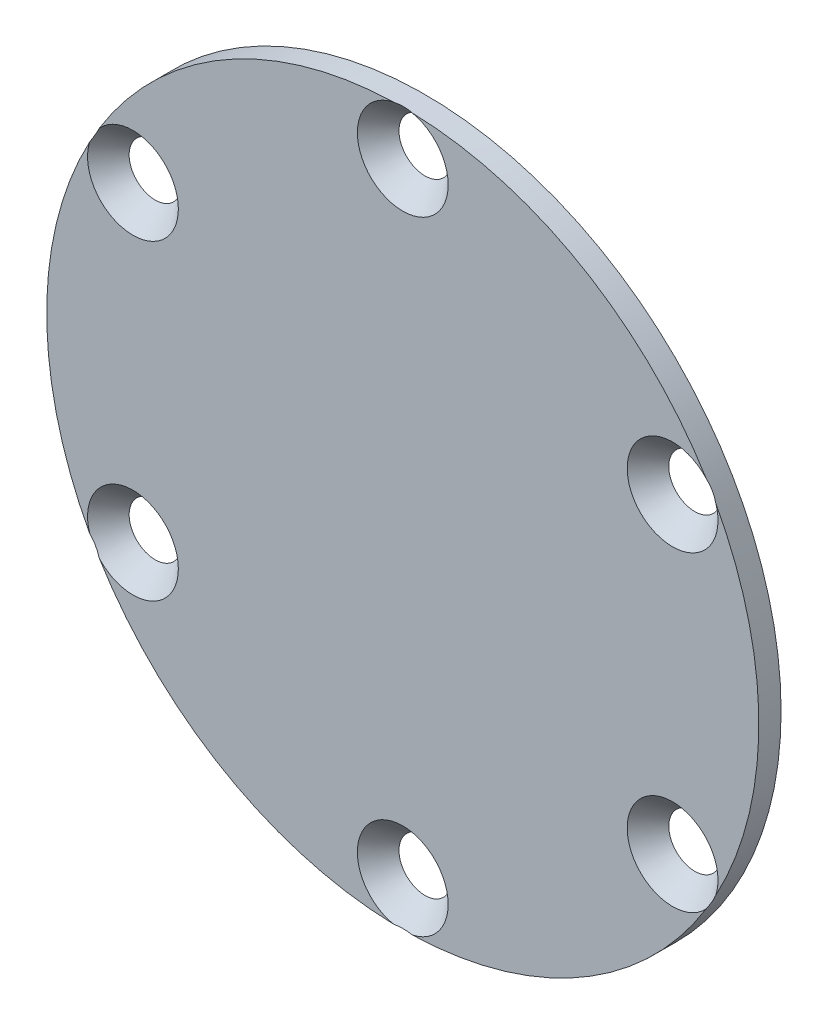
ISO-10303-21;
HEADER;
FILE_DESCRIPTION(('STEP AP214'),'2;1');
FILE_NAME('part.step','',(''),(''),'','','');
FILE_SCHEMA(('AUTOMOTIVE_DESIGN { 1 0 10303 214 1 1 1 1 }'));
ENDSEC;
DATA;
#1=APPLICATION_CONTEXT('core data for automotive mechanical design processes');
#2=APPLICATION_PROTOCOL_DEFINITION('international standard','automotive_design',2000,#1);
#3=PRODUCT_CONTEXT('',#1,'mechanical');
#4=PRODUCT('Part','Part','',(#3));
#5=PRODUCT_RELATED_PRODUCT_CATEGORY('part','',(#4));
#6=PRODUCT_DEFINITION_FORMATION('','',#4);
#7=PRODUCT_DEFINITION_CONTEXT('part definition',#1,'design');
#8=PRODUCT_DEFINITION('design','',#6,#7);
#9=PRODUCT_DEFINITION_SHAPE('','',#8);
#10=(LENGTH_UNIT() NAMED_UNIT(*) SI_UNIT(.MILLI.,.METRE.));
#11=(NAMED_UNIT(*) PLANE_ANGLE_UNIT() SI_UNIT($,.RADIAN.));
#12=(NAMED_UNIT(*) SI_UNIT($,.STERADIAN.) SOLID_ANGLE_UNIT());
#13=UNCERTAINTY_MEASURE_WITH_UNIT(LENGTH_MEASURE(1.E-05),#10,'distance_accuracy_value','');
#14=(GEOMETRIC_REPRESENTATION_CONTEXT(3) GLOBAL_UNCERTAINTY_ASSIGNED_CONTEXT((#13)) GLOBAL_UNIT_ASSIGNED_CONTEXT((#10,
#11,#12)) REPRESENTATION_CONTEXT('',''));
#15=CARTESIAN_POINT('',(0.,0.,0.));
#16=DIRECTION('',(0.,0.,1.));
#17=DIRECTION('',(1.,0.,0.));
#18=AXIS2_PLACEMENT_3D('',#15,#16,#17);
#19=CARTESIAN_POINT('',(0.,0.,1.5875));
#20=DIRECTION('',(0.,0.,-1.));
#21=DIRECTION('',(-1.,0.,0.));
#22=AXIS2_PLACEMENT_3D('',#19,#20,#21);
#23=CYLINDRICAL_SURFACE('',#22,25.4);
#24=CARTESIAN_POINT('',(0.,0.,1.5875));
#25=DIRECTION('',(0.,0.,1.));
#26=DIRECTION('',(1.,0.,0.));
#27=AXIS2_PLACEMENT_3D('',#24,#25,#26);
#28=CIRCLE('',#27,25.4);
#29=CARTESIAN_POINT('',(-0.682167803609317,25.3908378571428,1.5875));
#30=VERTEX_POINT('',#29);
#31=CARTESIAN_POINT('',(-21.6480267058526,13.2861935761411,1.5875));
#32=VERTEX_POINT('',#31);
#33=EDGE_CURVE('E94',#30,#32,#28,.T.);
#34=ORIENTED_EDGE('',*,*,#33,.F.);
#35=CARTESIAN_POINT('',(-1.10813327144891,25.3758160588523,1.70426259723294));
#36=CARTESIAN_POINT('',(-1.03858546910732,25.3788538370796,1.68100724010702));
#37=CARTESIAN_POINT('',(-0.968407543113004,25.3816312618641,1.65953701311462));
#38=CARTESIAN_POINT('',(-0.826688796066698,25.3866425824605,1.62052580747523));
#39=CARTESIAN_POINT('',(-0.75514407573568,25.3888745491067,1.6029987919676));
#40=CARTESIAN_POINT('',(-0.602140773588031,25.3929908906209,1.57050348648753));
#41=CARTESIAN_POINT('',(-0.520553288266637,25.3947978058421,1.55612227692921));
#42=CARTESIAN_POINT('',(-0.356490417125455,25.3976307080457,1.53349858253767));
#43=CARTESIAN_POINT('',(-0.274014817999217,25.398656502976,1.52525760739814));
#44=CARTESIAN_POINT('',(-0.108784871770269,25.3999011973798,1.51525061839919));
#45=CARTESIAN_POINT('',(-0.026031123351573,25.4001212972263,1.513474972125));
#46=CARTESIAN_POINT('',(0.139330093782125,25.3997523575857,1.51644557388797));
#47=CARTESIAN_POINT('',(0.22193760376031,25.3991636031298,1.52118952449341));
#48=CARTESIAN_POINT('',(0.367899173950457,25.3974153879827,1.53521019689812));
#49=CARTESIAN_POINT('',(0.43138094193177,25.3964151774016,1.5432186203364));
#50=CARTESIAN_POINT('',(0.557730565008054,25.3939545635952,1.5628256963906));
#51=CARTESIAN_POINT('',(0.620598795374312,25.3924944625676,1.57442199130001));
#52=CARTESIAN_POINT('',(0.802397667513501,25.3876029526052,1.61303783201307));
#53=CARTESIAN_POINT('',(0.920385540794634,25.3835855706627,1.64449952175929));
#54=CARTESIAN_POINT('',(1.15311526480074,25.374079805848,1.71770283464408));
#55=CARTESIAN_POINT('',(1.2678536227911,25.3685899019818,1.7594550834468));
#56=CARTESIAN_POINT('',(1.49441861886097,25.3562546261583,1.85145781773012));
#57=CARTESIAN_POINT('',(1.60622805418499,25.349402686106,1.9017493032261));
#58=CARTESIAN_POINT('',(1.82647288878544,25.3344859200496,2.00892993635709));
#59=CARTESIAN_POINT('',(1.93490942121521,25.3264215068151,2.06581683717262));
#60=CARTESIAN_POINT('',(2.13747427703046,25.3100852627391,2.17851558005401));
#61=CARTESIAN_POINT('',(2.23190439137552,25.3019252512772,2.23380665698919));
#62=CARTESIAN_POINT('',(2.41788342749443,25.2848267124478,2.34736556954315));
#63=CARTESIAN_POINT('',(2.50944898579432,25.2758946952924,2.4056070711099));
#64=CARTESIAN_POINT('',(2.6000760301225,25.2665708919431,2.4651659220088));
#65=B_SPLINE_CURVE_WITH_KNOTS('',3,(#35,#36,#37,#38,#39,#40,#41,#42,#43,#44,#45,#46,#47,#48,#49,
#50,#51,#52,#53,#54,#55,#56,#57,#58,#59,#60,#61,#62,#63,#64),.UNSPECIFIED.,.F.,.F.,(4,2,2,2,2,2,
2,2,2,2,2,2,2,2,4),(0.,0.220192199221614,0.441152251301994,0.68952104599925,0.937950886767347,
1.18601045082805,1.43398262393278,1.62585404453421,1.81759964704789,2.18349923150444,
2.54977822539337,2.91786834223411,3.28583343050666,3.6149439274665,3.9415086906618),.UNSPECIFIED.);
#66=CARTESIAN_POINT('',(0.682167803609285,25.3908378571429,1.5875));
#67=VERTEX_POINT('',#66);
#68=EDGE_CURVE('E11',#30,#67,#65,.T.);
#69=ORIENTED_EDGE('',*,*,#68,.T.);
#70=CARTESIAN_POINT('',(21.6480267058527,13.2861935761409,1.5875));
#71=VERTEX_POINT('',#70);
#72=EDGE_CURVE('E96',#71,#67,#28,.T.);
#73=ORIENTED_EDGE('',*,*,#72,.F.);
#74=CARTESIAN_POINT('',(21.3810091530071,13.7117631105204,1.7304857640241));
#75=CARTESIAN_POINT('',(21.4251537785731,13.6429301950826,1.70148609943137));
#76=CARTESIAN_POINT('',(21.4694464799764,13.573129703822,1.67486845359258));
#77=CARTESIAN_POINT('',(21.5583420855567,13.4314886256569,1.62701288608322));
#78=CARTESIAN_POINT('',(21.6029455222661,13.3596410088896,1.6057968574607));
#79=CARTESIAN_POINT('',(21.6899144454002,13.2179490514082,1.5704989962979));
#80=CARTESIAN_POINT('',(21.7322814136551,13.1481816099002,1.55611598912737));
#81=CARTESIAN_POINT('',(21.8167820941267,13.0074882839178,1.53349096011117));
#82=CARTESIAN_POINT('',(21.8589157549769,12.9365621569347,1.52525024109716));
#83=CARTESIAN_POINT('',(21.9426075139185,12.7940919228617,1.51524821748298));
#84=CARTESIAN_POINT('',(21.9841665386342,12.7225492144744,1.51347486129034));
#85=CARTESIAN_POINT('',(22.0665113380646,12.5791854810932,1.51644739067956));
#86=CARTESIAN_POINT('',(22.1072973742836,12.5073645604929,1.52119103013882));
#87=CARTESIAN_POINT('',(22.1787531323253,12.3801036678383,1.53520953289352));
#88=CARTESIAN_POINT('',(22.2096244990284,12.3246327385235,1.54321688713062));
#89=CARTESIAN_POINT('',(22.2706685039146,12.2139803920665,1.5628231854216));
#90=CARTESIAN_POINT('',(22.3008414432226,12.1587988583996,1.57442054944183));
#91=CARTESIAN_POINT('',(22.3875377105626,11.9988497716892,1.61305111060762));
#92=CARTESIAN_POINT('',(22.4430808427565,11.8946064231529,1.64453252650078));
#93=CARTESIAN_POINT('',(22.551267665268,11.6881966842813,1.7177852553753));
#94=CARTESIAN_POINT('',(22.6039082607159,11.5860325814749,1.7595673014942));
#95=CARTESIAN_POINT('',(22.7065031015382,11.3836566281053,1.85158894410794));
#96=CARTESIAN_POINT('',(22.7564460637336,11.2834539503464,1.90186090464235));
#97=CARTESIAN_POINT('',(22.8535969103649,11.0853631820879,2.00899190469568));
#98=CARTESIAN_POINT('',(22.9008058304346,10.9874742235962,2.06584842522786));
#99=CARTESIAN_POINT('',(22.9731820475459,10.8349756884023,2.15946328139934));
#100=CARTESIAN_POINT('',(22.9991800108234,10.7796754480238,2.19447816971296));
#101=CARTESIAN_POINT('',(23.0502776971159,10.669973615359,2.26584271803109));
#102=CARTESIAN_POINT('',(23.0753812536929,10.6155689165087,2.30218484909052));
#103=CARTESIAN_POINT('',(23.1001269296781,10.5614457264505,2.33917547271507));
#104=B_SPLINE_CURVE_WITH_KNOTS('',3,(#74,#75,#76,#77,#78,#79,#80,#81,#82,#83,#84,#85,#86,#87,
#88,#89,#90,#91,#92,#93,#94,#95,#96,#97,#98,#99,#100,#101,#102,#103),.UNSPECIFIED.,.F.,.F.,(4,2,
2,2,2,2,2,2,2,2,2,2,2,2,4),(0.,0.260320342657759,0.521679558673097,0.770100636879063,
1.01857439232923,1.26658489265943,1.51450993608704,1.7063606066707,1.89812695977924,
2.26421816266294,2.63069245268699,2.99859667288012,3.36636060983308,3.57762360089746,
3.78783282114336),.UNSPECIFIED.);
#105=CARTESIAN_POINT('',(22.330194509462,12.1046442810019,1.5875));
#106=VERTEX_POINT('',#105);
#107=EDGE_CURVE('E44',#71,#106,#104,.T.);
#108=ORIENTED_EDGE('',*,*,#107,.T.);
#109=CARTESIAN_POINT('',(22.3301945094629,-12.1046442810002,1.5875));
#110=VERTEX_POINT('',#109);
#111=EDGE_CURVE('E106',#110,#106,#28,.T.);
#112=ORIENTED_EDGE('',*,*,#111,.F.);
#113=CARTESIAN_POINT('',(23.1814585491073,-10.3817137090184,2.46505114810237));
#114=CARTESIAN_POINT('',(23.1515876396771,-10.4484106155031,2.41726611692696));
#115=CARTESIAN_POINT('',(23.1211954979839,-10.5155040932901,2.37034258851684));
#116=CARTESIAN_POINT('',(23.0592697251213,-10.6506158108581,2.27855099910734));
#117=CARTESIAN_POINT('',(23.0277355571746,-10.7186344758673,2.2336839277356));
#118=CARTESIAN_POINT('',(22.9631663808992,-10.856280108849,2.14599193214943));
#119=CARTESIAN_POINT('',(22.9301204379703,-10.9259160343221,2.10318896445831));
#120=CARTESIAN_POINT('',(22.8627118706754,-11.0662759699742,2.02053766943613));
#121=CARTESIAN_POINT('',(22.8283494120389,-11.1369998425306,1.98068897204874));
#122=CARTESIAN_POINT('',(22.7221289660061,-11.3530120241208,1.86523926683746));
#123=CARTESIAN_POINT('',(22.6480557623411,-11.5001774795046,1.79501931620064));
#124=CARTESIAN_POINT('',(22.4938126864946,-11.7990009273611,1.67479100435845));
#125=CARTESIAN_POINT('',(22.4136685630177,-11.9506384450719,1.62470240098767));
#126=CARTESIAN_POINT('',(22.2919512937197,-12.1752013489967,1.57045560918109));
#127=CARTESIAN_POINT('',(22.252633207184,-12.2469215265158,1.55605338499192));
#128=CARTESIAN_POINT('',(22.1728646199339,-12.3907557748581,1.53340909977394));
#129=CARTESIAN_POINT('',(22.1324137597674,-12.4628699647305,1.52516901763232));
#130=CARTESIAN_POINT('',(22.0508658350057,-12.6065896322718,1.51522142629661));
#131=CARTESIAN_POINT('',(22.009774360909,-12.6781954820758,1.51347356902007));
#132=CARTESIAN_POINT('',(21.9269676342852,-12.8208771059618,1.51646817992184));
#133=CARTESIAN_POINT('',(21.8852526148994,-12.8919530639727,1.52120827948725));
#134=CARTESIAN_POINT('',(21.8108695899338,-13.017297069676,1.53520786734876));
#135=CARTESIAN_POINT('',(21.7782748498308,-13.0717533256563,1.54321256591905));
#136=CARTESIAN_POINT('',(21.7129691722526,-13.179945541526,1.56281694614074));
#137=CARTESIAN_POINT('',(21.6802582236153,-13.2336814297189,1.57441698289634));
#138=CARTESIAN_POINT('',(21.5851768217254,-13.3885898057994,1.61301080663122));
#139=CARTESIAN_POINT('',(21.5227704223982,-13.488656388605,1.64443240598781));
#140=CARTESIAN_POINT('',(21.3983067748759,-13.685248967243,1.71753496760279));
#141=CARTESIAN_POINT('',(21.3362499463545,-13.781771258481,1.75922633200466));
#142=CARTESIAN_POINT('',(21.212284734069,-13.9718266560027,1.85119165027065));
#143=CARTESIAN_POINT('',(21.1503805156757,-14.0653337448685,1.90152430778462));
#144=CARTESIAN_POINT('',(21.027207053808,-14.2488165482237,2.00880395470955));
#145=CARTESIAN_POINT('',(20.965937638598,-14.3387932371894,2.06574910148253));
#146=CARTESIAN_POINT('',(20.8416864359646,-14.5188328783428,2.18706315512061));
#147=CARTESIAN_POINT('',(20.7787249052945,-14.6087764579337,2.25162848256032));
#148=CARTESIAN_POINT('',(20.6532404945114,-14.7856489169382,2.38518726422885));
#149=CARTESIAN_POINT('',(20.5907177132492,-14.8725771333466,2.45418168291934));
#150=CARTESIAN_POINT('',(20.4670907471154,-15.0422413960153,2.59440896752139));
#151=CARTESIAN_POINT('',(20.405981056701,-15.125024432115,2.66558050441011));
#152=CARTESIAN_POINT('',(20.283989382095,-15.2882342855845,2.81061068938628));
#153=CARTESIAN_POINT('',(20.223107261695,-15.3686628203186,2.88446728615431));
#154=CARTESIAN_POINT('',(20.1622559386768,-15.4480884080617,2.95937929734814));
#155=B_SPLINE_CURVE_WITH_KNOTS('',3,(#113,#114,#115,#116,#117,#118,#119,#120,#121,#122,#123,
#124,#125,#126,#127,#128,#129,#130,#131,#132,#133,#134,#135,#136,#137,#138,#139,#140,#141,#142,
#143,#144,#145,#146,#147,#148,#149,#150,#151,#152,#153,#154),.UNSPECIFIED.,.F.,.F.,(4,2,2,2,2,2,
2,2,2,2,2,2,2,2,2,2,2,2,2,2,4),(0.,0.26195643045652,0.524037626190311,0.788472305841067,
1.05287380584499,1.58921149474204,2.12338965663384,2.37233504246596,2.62136033939602,
2.86883537158573,3.11622008008078,3.3080191178143,3.49983710518664,3.86534653341997,
4.23122771594704,4.59970065363787,4.96807115785892,5.35003692501063,5.73208615154805,
6.10736549833682,6.48236392936831),.UNSPECIFIED.);
#156=CARTESIAN_POINT('',(21.6480267058522,-13.2861935761417,1.5875));
#157=VERTEX_POINT('',#156);
#158=EDGE_CURVE('E127',#110,#157,#155,.T.);
#159=ORIENTED_EDGE('',*,*,#158,.T.);
#160=CARTESIAN_POINT('',(0.682167803610037,-25.3908378571428,1.5875));
#161=VERTEX_POINT('',#160);
#162=EDGE_CURVE('E117',#161,#157,#28,.T.);
#163=ORIENTED_EDGE('',*,*,#162,.F.);
#164=CARTESIAN_POINT('',(1.10813327144959,-25.3758160588523,1.70426259723293));
#165=CARTESIAN_POINT('',(1.03858546910801,-25.3788538370796,1.68100724010701));
#166=CARTESIAN_POINT('',(0.968407543113698,-25.3816312618641,1.65953701311462));
#167=CARTESIAN_POINT('',(0.826688796067403,-25.3866425824605,1.62052580747523));
#168=CARTESIAN_POINT('',(0.755144075736392,-25.3888745491067,1.6029987919676));
#169=CARTESIAN_POINT('',(0.602140773588749,-25.3929908906209,1.57050348648753));
#170=CARTESIAN_POINT('',(0.520553288267355,-25.3947978058421,1.55612227692921));
#171=CARTESIAN_POINT('',(0.356490417126174,-25.3976307080457,1.53349858253767));
#172=CARTESIAN_POINT('',(0.274014817999936,-25.398656502976,1.52525760739814));
#173=CARTESIAN_POINT('',(0.108784871770987,-25.3999011973798,1.51525061839919));
#174=CARTESIAN_POINT('',(0.0260311233522914,-25.4001212972263,1.513474972125));
#175=CARTESIAN_POINT('',(-0.139330093781407,-25.3997523575857,1.51644557388797));
#176=CARTESIAN_POINT('',(-0.221937603759592,-25.3991636031298,1.52118952449341));
#177=CARTESIAN_POINT('',(-0.367899173949739,-25.3974153879827,1.53521019689813));
#178=CARTESIAN_POINT('',(-0.431380941931052,-25.3964151774016,1.54321862033641));
#179=CARTESIAN_POINT('',(-0.557730565007337,-25.3939545635953,1.56282569639061));
#180=CARTESIAN_POINT('',(-0.620598795373596,-25.3924944625676,1.57442199130001));
#181=CARTESIAN_POINT('',(-0.802397667512786,-25.3876029526053,1.61303783201306));
#182=CARTESIAN_POINT('',(-0.920385540793918,-25.3835855706627,1.64449952175929));
#183=CARTESIAN_POINT('',(-1.15311526480002,-25.3740798058481,1.71770283464409));
#184=CARTESIAN_POINT('',(-1.26785362279039,-25.3685899019819,1.7594550834468));
#185=CARTESIAN_POINT('',(-1.49441861886026,-25.3562546261583,1.85145781773012));
#186=CARTESIAN_POINT('',(-1.60622805418428,-25.349402686106,1.9017493032261));
#187=CARTESIAN_POINT('',(-1.82647288878473,-25.3344859200497,2.00892993635709));
#188=CARTESIAN_POINT('',(-1.9349094212145,-25.3264215068152,2.06581683717263));
#189=CARTESIAN_POINT('',(-2.13747427702976,-25.3100852627392,2.17851558005402));
#190=CARTESIAN_POINT('',(-2.23190439137485,-25.3019252512772,2.23380665698922));
#191=CARTESIAN_POINT('',(-2.41788342749378,-25.2848267124479,2.34736556954319));
#192=CARTESIAN_POINT('',(-2.5094489857937,-25.2758946952925,2.40560707110996));
#193=CARTESIAN_POINT('',(-2.60007603012189,-25.2665708919431,2.46516592200886));
#194=B_SPLINE_CURVE_WITH_KNOTS('',3,(#164,#165,#166,#167,#168,#169,#170,#171,#172,#173,#174,
#175,#176,#177,#178,#179,#180,#181,#182,#183,#184,#185,#186,#187,#188,#189,#190,#191,#192,#193),
.UNSPECIFIED.,.F.,.F.,(4,2,2,2,2,2,2,2,2,2,2,2,2,2,4),(0.,0.220192199221596,0.441152251301956,
0.689521045999212,0.937950886767309,1.18601045082801,1.43398262393274,1.62585404453418,
1.81759964704785,2.1834992315044,2.54977822539334,2.91786834223408,3.28583343050663,
3.61494392746653,3.94150869066188),.UNSPECIFIED.);
#195=CARTESIAN_POINT('',(-0.682167803608558,-25.3908378571429,1.5875));
#196=VERTEX_POINT('',#195);
#197=EDGE_CURVE('E128',#161,#196,#194,.T.);
#198=ORIENTED_EDGE('',*,*,#197,.T.);
#199=CARTESIAN_POINT('',(-21.6480267058532,-13.2861935761402,1.5875));
#200=VERTEX_POINT('',#199);
#201=EDGE_CURVE('E112',#200,#196,#28,.T.);
#202=ORIENTED_EDGE('',*,*,#201,.F.);
#203=CARTESIAN_POINT('',(-20.1622559386765,-15.4480884080621,2.95937929734809));
#204=CARTESIAN_POINT('',(-20.211112535278,-15.3843207230846,2.89922134489442));
#205=CARTESIAN_POINT('',(-20.2599898574171,-15.319903135828,2.83975698915963));
#206=CARTESIAN_POINT('',(-20.3578620475094,-15.1896053271253,2.7224997042934));
#207=CARTESIAN_POINT('',(-20.4068569475928,-15.1237246521093,2.66470730663881));
#208=CARTESIAN_POINT('',(-20.5053719425386,-14.9898856853428,2.5506972118834));
#209=CARTESIAN_POINT('',(-20.5548932447761,-14.921915648461,2.49449428473609));
#210=CARTESIAN_POINT('',(-20.6541630941122,-14.7842062064614,2.38452289616755));
#211=CARTESIAN_POINT('',(-20.7039116191378,-14.7144669703322,2.33075420359155));
#212=CARTESIAN_POINT('',(-20.8041841383273,-14.5723557867048,2.2256458390809));
#213=CARTESIAN_POINT('',(-20.8547110235048,-14.4999652323659,2.17433380699738));
#214=CARTESIAN_POINT('',(-20.9561307187924,-14.3529984421607,2.07533696148488));
#215=CARTESIAN_POINT('',(-21.0070235894848,-14.2784218378405,2.02765276444579));
#216=CARTESIAN_POINT('',(-21.1600362868256,-14.0515496160753,1.89146232168685));
#217=CARTESIAN_POINT('',(-21.262858953956,-13.8955907220359,1.80941999550237));
#218=CARTESIAN_POINT('',(-21.3896570925533,-13.6983368081042,1.72461259629034));
#219=CARTESIAN_POINT('',(-21.4130264617274,-13.6617787921348,1.70965745989937));
#220=CARTESIAN_POINT('',(-21.4598261831439,-13.5881479250447,1.68115895910343));
#221=CARTESIAN_POINT('',(-21.4832565413177,-13.5510750222032,1.66761573770609));
#222=CARTESIAN_POINT('',(-21.5535965671091,-13.4391307788895,1.62927696430372));
#223=CARTESIAN_POINT('',(-21.6005758650882,-13.3635017576301,1.60675829718865));
#224=CARTESIAN_POINT('',(-21.6898872298743,-13.2179933522559,1.57051033727375));
#225=CARTESIAN_POINT('',(-21.7322233155694,-13.1482772836465,1.55613574358679));
#226=CARTESIAN_POINT('',(-21.8166644539523,-13.0076852112935,1.53351827013411));
#227=CARTESIAN_POINT('',(-21.8587694571499,-12.9368089711036,1.52527665659682));
#228=CARTESIAN_POINT('',(-21.9424628405795,-12.7943404245131,1.51525661838483));
#229=CARTESIAN_POINT('',(-21.9840514543703,-12.7227484703974,1.51347515719596));
#230=CARTESIAN_POINT('',(-22.0664547168609,-12.5792851644762,1.51644090838435));
#231=CARTESIAN_POINT('',(-22.1072696304008,-12.5074139188085,1.52118584429555));
#232=CARTESIAN_POINT('',(-22.1787575369295,-12.3800958642133,1.53521019818803));
#233=CARTESIAN_POINT('',(-22.2096329594621,-12.3246176589989,1.5432184749071));
#234=CARTESIAN_POINT('',(-22.270677962669,-12.2139629901543,1.56282735274361));
#235=CARTESIAN_POINT('',(-22.3008480439656,-12.1587863352123,1.57442531731633));
#236=CARTESIAN_POINT('',(-22.3566939042799,-12.0557549299534,1.59930597439166));
#237=CARTESIAN_POINT('',(-22.3824578962424,-12.0078516742173,1.61219361510991));
#238=CARTESIAN_POINT('',(-22.4334046199329,-11.912400559712,1.64035624290803));
#239=CARTESIAN_POINT('',(-22.4585869448785,-11.8648529644986,1.65563284593291));
#240=CARTESIAN_POINT('',(-22.5498076820999,-11.6912999877299,1.71566730646798));
#241=CARTESIAN_POINT('',(-22.6139918996217,-11.5666022841797,1.767127186572));
#242=CARTESIAN_POINT('',(-22.738187716122,-11.3205077206362,1.88210205025097));
#243=CARTESIAN_POINT('',(-22.7981897259741,-11.1991188113666,1.94564356797708));
#244=CARTESIAN_POINT('',(-22.9141706138327,-10.9598548193414,2.08158746386361));
#245=CARTESIAN_POINT('',(-22.9701574659279,-10.8419730602879,2.15397146135128));
#246=CARTESIAN_POINT('',(-23.0514113116417,-10.6675452707806,2.2674126687111));
#247=CARTESIAN_POINT('',(-23.0779830615596,-10.6099326063234,2.30594237799811));
#248=CARTESIAN_POINT('',(-23.1303143508953,-10.4953570208413,2.38445495065379));
#249=CARTESIAN_POINT('',(-23.1560741084073,-10.4383939280163,2.42443741750542));
#250=CARTESIAN_POINT('',(-23.1814585491072,-10.3817137090185,2.46505114810346));
#251=B_SPLINE_CURVE_WITH_KNOTS('',3,(#203,#204,#205,#206,#207,#208,#209,#210,#211,#212,#213,
#214,#215,#216,#217,#218,#219,#220,#221,#222,#223,#224,#225,#226,#227,#228,#229,#230,#231,#232,
#233,#234,#235,#236,#237,#238,#239,#240,#241,#242,#243,#244,#245,#246,#247,#248,#249,#250),
.UNSPECIFIED.,.F.,.F.,(4,2,2,2,2,2,2,2,2,2,2,2,2,2,2,2,2,2,2,2,2,2,2,4),(0.,0.301088186110945,
0.602271052399015,0.905676776662247,1.20905362884374,1.51528716594184,1.82157261820412,
2.43189295488841,2.56955773685001,2.7072364488452,2.98247199828314,3.23072115812565,
3.47902155782052,3.72720523186544,3.97530235916065,4.16718116939298,4.35891938206731,
4.5265549360935,4.69430437680761,5.14162364624126,5.58993692654234,6.03733367746496,
6.26000216996644,6.48261033703742),.UNSPECIFIED.);
#252=CARTESIAN_POINT('',(-22.3301945094611,-12.1046442810037,1.5875));
#253=VERTEX_POINT('',#252);
#254=EDGE_CURVE('E114',#200,#253,#251,.T.);
#255=ORIENTED_EDGE('',*,*,#254,.T.);
#256=CARTESIAN_POINT('',(-22.3301945094619,12.1046442810022,1.5875));
#257=VERTEX_POINT('',#256);
#258=EDGE_CURVE('E105',#257,#253,#28,.T.);
#259=ORIENTED_EDGE('',*,*,#258,.F.);
#260=CARTESIAN_POINT('',(-23.100126929678,10.5614457264508,2.3391754727151));
#261=CARTESIAN_POINT('',(-23.0758390509903,10.6145676602522,2.30286863137167));
#262=CARTESIAN_POINT('',(-23.0512071548014,10.6679591413035,2.26718836001543));
#263=CARTESIAN_POINT('',(-23.0012025571929,10.775351230976,2.19725788299899));
#264=CARTESIAN_POINT('',(-22.9758296566812,10.8293520008635,2.16300806779169));
#265=CARTESIAN_POINT('',(-22.8983248549288,10.9927841776184,2.06241936817971));
#266=CARTESIAN_POINT('',(-22.8450091968999,11.1032020960721,1.99854807710524));
#267=CARTESIAN_POINT('',(-22.7351365559328,11.3264727431667,1.87964010737613));
#268=CARTESIAN_POINT('',(-22.6785940771037,11.4393133433401,1.82456756241136));
#269=CARTESIAN_POINT('',(-22.5618959656449,11.6677864506333,1.72555662198312));
#270=CARTESIAN_POINT('',(-22.5017478835729,11.7834128396811,1.68159589984322));
#271=CARTESIAN_POINT('',(-22.4219096027437,11.9339611983888,1.63391487659061));
#272=CARTESIAN_POINT('',(-22.4038745728702,11.9677853146311,1.62381392275315));
#273=CARTESIAN_POINT('',(-22.3674897075237,12.0356506993008,1.60482589692743));
#274=CARTESIAN_POINT('',(-22.3491395792708,12.0696921489109,1.59594003127233));
#275=CARTESIAN_POINT('',(-22.2920688266472,12.174983207996,1.57051461803215));
#276=CARTESIAN_POINT('',(-22.2528600554964,12.2465073374738,1.5561384306391));
#277=CARTESIAN_POINT('',(-22.1733346067603,12.38991342187,1.53352206600184));
#278=CARTESIAN_POINT('',(-22.1330179124812,12.4617953821668,1.52528198126784));
#279=CARTESIAN_POINT('',(-22.0514875792999,12.6055035241873,1.51525870630421));
#280=CARTESIAN_POINT('',(-22.0102739733916,12.6773297078625,1.51347527896269));
#281=CARTESIAN_POINT('',(-21.9272195325971,12.8204479288853,1.51643948318636));
#282=CARTESIAN_POINT('',(-21.8853789466865,12.8917401622375,1.52118458685096));
#283=CARTESIAN_POINT('',(-21.8108588723174,13.017315144059,1.5352098194003));
#284=CARTESIAN_POINT('',(-21.7782535474054,13.0717889739027,1.54321753300183));
#285=CARTESIAN_POINT('',(-21.7129466873479,13.1799824357082,1.56282512482537));
#286=CARTESIAN_POINT('',(-21.6802452178008,13.2337024807199,1.57442294845884));
#287=CARTESIAN_POINT('',(-21.6030436160663,13.3594810825792,1.60575768804766));
#288=CARTESIAN_POINT('',(-21.5585348703619,13.4311780099818,1.62692158494956));
#289=CARTESIAN_POINT('',(-21.4696363950139,13.5728305364465,1.67475375925123));
#290=CARTESIAN_POINT('',(-21.4252467080792,13.6427855701427,1.70142379834033));
#291=CARTESIAN_POINT('',(-21.3810091530069,13.7117631105206,1.73048576402409));
#292=B_SPLINE_CURVE_WITH_KNOTS('',3,(#260,#261,#262,#263,#264,#265,#266,#267,#268,#269,#270,
#271,#272,#273,#274,#275,#276,#277,#278,#279,#280,#281,#282,#283,#284,#285,#286,#287,#288,#289,
#290,#291),.UNSPECIFIED.,.F.,.F.,(4,2,2,2,2,2,2,2,2,2,2,2,2,2,2,4),(0.,0.206316508280793,
0.412688968862016,0.827159505984857,1.23989487901016,1.65179424140583,1.7706997432168,
1.88972244976532,2.13795581287814,2.38619291837514,2.63442090761258,2.88255280798879,
3.07441611932163,3.26616983132896,3.5269678483189,3.78784943726777),.UNSPECIFIED.);
#293=EDGE_CURVE('E102',#257,#32,#292,.T.);
#294=ORIENTED_EDGE('',*,*,#293,.T.);
#295=EDGE_LOOP('',(#34,#69,#73,#108,#112,#159,#163,#198,#202,#255,#259,#294));
#296=FACE_BOUND('',#295,.T.);
#297=CARTESIAN_POINT('',(0.,0.,0.));
#298=DIRECTION('',(0.,0.,1.));
#299=DIRECTION('',(1.,0.,0.));
#300=AXIS2_PLACEMENT_3D('',#297,#298,#299);
#301=CIRCLE('',#300,25.4);
#302=CARTESIAN_POINT('',(25.4,0.,0.));
#303=VERTEX_POINT('',#302);
#304=EDGE_CURVE('E103',#303,#303,#301,.T.);
#305=ORIENTED_EDGE('',*,*,#304,.T.);
#306=EDGE_LOOP('',(#305));
#307=FACE_BOUND('',#306,.T.);
#308=ADVANCED_FACE('F32',(#296,#307),#23,.T.);
#309=CARTESIAN_POINT('',(0.,0.,1.5875));
#310=DIRECTION('',(0.,0.,1.));
#311=DIRECTION('',(1.,0.,0.));
#312=AXIS2_PLACEMENT_3D('',#309,#310,#311);
#313=PLANE('',#312);
#314=CARTESIAN_POINT('',(0.,22.225,1.5875));
#315=DIRECTION('',(0.,0.,1.));
#316=DIRECTION('',(1.,0.,0.));
#317=AXIS2_PLACEMENT_3D('',#314,#315,#316);
#318=CIRCLE('',#317,3.2385);
#319=EDGE_CURVE('E50',#30,#67,#318,.T.);
#320=ORIENTED_EDGE('',*,*,#319,.F.);
#321=ORIENTED_EDGE('',*,*,#33,.T.);
#322=CARTESIAN_POINT('',(-19.247414599109,11.1125000000002,1.5875));
#323=DIRECTION('',(0.,0.,1.));
#324=DIRECTION('',(1.,0.,0.));
#325=AXIS2_PLACEMENT_3D('',#322,#323,#324);
#326=CIRCLE('',#325,3.2385);
#327=EDGE_CURVE('E241',#257,#32,#326,.T.);
#328=ORIENTED_EDGE('',*,*,#327,.F.);
#329=ORIENTED_EDGE('',*,*,#258,.T.);
#330=CARTESIAN_POINT('',(-19.2474145991087,-11.1125000000003,1.5875));
#331=DIRECTION('',(0.,0.,1.));
#332=DIRECTION('',(1.,0.,0.));
#333=AXIS2_PLACEMENT_3D('',#330,#331,#332);
#334=CIRCLE('',#333,3.2385);
#335=EDGE_CURVE('E236',#200,#253,#334,.T.);
#336=ORIENTED_EDGE('',*,*,#335,.F.);
#337=ORIENTED_EDGE('',*,*,#201,.T.);
#338=CARTESIAN_POINT('',(6.30260256199605E-13,-22.225,1.5875));
#339=DIRECTION('',(0.,0.,1.));
#340=DIRECTION('',(1.,0.,0.));
#341=AXIS2_PLACEMENT_3D('',#338,#339,#340);
#342=CIRCLE('',#341,3.2385);
#343=EDGE_CURVE('E255',#161,#196,#342,.T.);
#344=ORIENTED_EDGE('',*,*,#343,.F.);
#345=ORIENTED_EDGE('',*,*,#162,.T.);
#346=CARTESIAN_POINT('',(19.2474145991096,-11.1124999999997,1.5875));
#347=DIRECTION('',(0.,0.,1.));
#348=DIRECTION('',(1.,0.,0.));
#349=AXIS2_PLACEMENT_3D('',#346,#347,#348);
#350=CIRCLE('',#349,3.2385);
#351=EDGE_CURVE('E125',#110,#157,#350,.T.);
#352=ORIENTED_EDGE('',*,*,#351,.F.);
#353=ORIENTED_EDGE('',*,*,#111,.T.);
#354=CARTESIAN_POINT('',(19.2474145991092,11.1125,1.5875));
#355=DIRECTION('',(0.,0.,1.));
#356=DIRECTION('',(1.,0.,0.));
#357=AXIS2_PLACEMENT_3D('',#354,#355,#356);
#358=CIRCLE('',#357,3.2385);
#359=EDGE_CURVE('E56',#71,#106,#358,.T.);
#360=ORIENTED_EDGE('',*,*,#359,.F.);
#361=ORIENTED_EDGE('',*,*,#72,.T.);
#362=EDGE_LOOP('',(#320,#321,#328,#329,#336,#337,#344,#345,#352,#353,#360,#361));
#363=FACE_BOUND('',#362,.T.);
#364=ADVANCED_FACE('F92',(#363),#313,.T.);
#365=CARTESIAN_POINT('',(0.,0.,0.));
#366=DIRECTION('',(0.,0.,1.));
#367=DIRECTION('',(1.,0.,0.));
#368=AXIS2_PLACEMENT_3D('',#365,#366,#367);
#369=PLANE('',#368);
#370=CARTESIAN_POINT('',(0.,22.225,0.));
#371=DIRECTION('',(0.,0.,1.));
#372=DIRECTION('',(1.,0.,0.));
#373=AXIS2_PLACEMENT_3D('',#370,#371,#372);
#374=CIRCLE('',#373,1.85850730371674);
#375=CARTESIAN_POINT('',(1.85850730371674,22.225,0.));
#376=VERTEX_POINT('',#375);
#377=EDGE_CURVE('E97',#376,#376,#374,.T.);
#378=ORIENTED_EDGE('',*,*,#377,.T.);
#379=EDGE_LOOP('',(#378));
#380=FACE_BOUND('',#379,.T.);
#381=CARTESIAN_POINT('',(19.2474145991092,11.1125,0.));
#382=DIRECTION('',(0.,0.,1.));
#383=DIRECTION('',(1.,0.,0.));
#384=AXIS2_PLACEMENT_3D('',#381,#382,#383);
#385=CIRCLE('',#384,1.85850730371674);
#386=CARTESIAN_POINT('',(21.1059219028259,11.1125,0.));
#387=VERTEX_POINT('',#386);
#388=EDGE_CURVE('E261',#387,#387,#385,.T.);
#389=ORIENTED_EDGE('',*,*,#388,.T.);
#390=EDGE_LOOP('',(#389));
#391=FACE_BOUND('',#390,.T.);
#392=CARTESIAN_POINT('',(19.2474145991096,-11.1124999999997,0.));
#393=DIRECTION('',(0.,0.,1.));
#394=DIRECTION('',(1.,0.,0.));
#395=AXIS2_PLACEMENT_3D('',#392,#393,#394);
#396=CIRCLE('',#395,1.85850730371674);
#397=CARTESIAN_POINT('',(21.1059219028264,-11.1124999999997,0.));
#398=VERTEX_POINT('',#397);
#399=EDGE_CURVE('E257',#398,#398,#396,.T.);
#400=ORIENTED_EDGE('',*,*,#399,.T.);
#401=EDGE_LOOP('',(#400));
#402=FACE_BOUND('',#401,.T.);
#403=CARTESIAN_POINT('',(6.30260256199605E-13,-22.225,0.));
#404=DIRECTION('',(0.,0.,1.));
#405=DIRECTION('',(1.,0.,0.));
#406=AXIS2_PLACEMENT_3D('',#403,#404,#405);
#407=CIRCLE('',#406,1.85850730371674);
#408=CARTESIAN_POINT('',(1.85850730371737,-22.225,0.));
#409=VERTEX_POINT('',#408);
#410=EDGE_CURVE('E244',#409,#409,#407,.T.);
#411=ORIENTED_EDGE('',*,*,#410,.T.);
#412=EDGE_LOOP('',(#411));
#413=FACE_BOUND('',#412,.T.);
#414=CARTESIAN_POINT('',(-19.2474145991087,-11.1125000000003,0.));
#415=DIRECTION('',(0.,0.,1.));
#416=DIRECTION('',(1.,0.,0.));
#417=AXIS2_PLACEMENT_3D('',#414,#415,#416);
#418=CIRCLE('',#417,1.85850730371674);
#419=CARTESIAN_POINT('',(-17.3889072953919,-11.1125000000003,0.));
#420=VERTEX_POINT('',#419);
#421=EDGE_CURVE('E239',#420,#420,#418,.T.);
#422=ORIENTED_EDGE('',*,*,#421,.T.);
#423=EDGE_LOOP('',(#422));
#424=FACE_BOUND('',#423,.T.);
#425=CARTESIAN_POINT('',(-19.247414599109,11.1125000000002,0.));
#426=DIRECTION('',(0.,0.,1.));
#427=DIRECTION('',(1.,0.,0.));
#428=AXIS2_PLACEMENT_3D('',#425,#426,#427);
#429=CIRCLE('',#428,1.85850730371674);
#430=CARTESIAN_POINT('',(-17.3889072953923,11.1125000000002,0.));
#431=VERTEX_POINT('',#430);
#432=EDGE_CURVE('E108',#431,#431,#429,.T.);
#433=ORIENTED_EDGE('',*,*,#432,.T.);
#434=EDGE_LOOP('',(#433));
#435=FACE_BOUND('',#434,.T.);
#436=ORIENTED_EDGE('',*,*,#304,.F.);
#437=EDGE_LOOP('',(#436));
#438=FACE_BOUND('',#437,.T.);
#439=ADVANCED_FACE('F172',(#380,#391,#402,#413,#424,#435,#438),#369,.F.);
#440=CARTESIAN_POINT('',(-19.247414599109,11.1125000000002,1.5875));
#441=DIRECTION('',(0.,0.,1.));
#442=DIRECTION('',(1.,0.,0.));
#443=AXIS2_PLACEMENT_3D('',#440,#441,#442);
#444=CONICAL_SURFACE('',#443,3.2385,0.715584993317674);
#445=ORIENTED_EDGE('',*,*,#327,.T.);
#446=ORIENTED_EDGE('',*,*,#293,.F.);
#447=EDGE_LOOP('',(#445,#446));
#448=FACE_BOUND('',#447,.T.);
#449=ORIENTED_EDGE('',*,*,#432,.F.);
#450=EDGE_LOOP('',(#449));
#451=FACE_BOUND('',#450,.T.);
#452=ADVANCED_FACE('F168',(#448,#451),#444,.F.);
#453=CARTESIAN_POINT('',(-19.2474145991087,-11.1125000000003,1.5875));
#454=DIRECTION('',(0.,0.,1.));
#455=DIRECTION('',(1.,0.,0.));
#456=AXIS2_PLACEMENT_3D('',#453,#454,#455);
#457=CONICAL_SURFACE('',#456,3.2385,0.715584993317675);
#458=ORIENTED_EDGE('',*,*,#335,.T.);
#459=ORIENTED_EDGE('',*,*,#254,.F.);
#460=EDGE_LOOP('',(#458,#459));
#461=FACE_BOUND('',#460,.T.);
#462=ORIENTED_EDGE('',*,*,#421,.F.);
#463=EDGE_LOOP('',(#462));
#464=FACE_BOUND('',#463,.T.);
#465=ADVANCED_FACE('F152',(#461,#464),#457,.F.);
#466=CARTESIAN_POINT('',(6.30260256199605E-13,-22.225,1.5875));
#467=DIRECTION('',(0.,0.,1.));
#468=DIRECTION('',(1.,0.,0.));
#469=AXIS2_PLACEMENT_3D('',#466,#467,#468);
#470=CONICAL_SURFACE('',#469,3.2385,0.715584993317675);
#471=ORIENTED_EDGE('',*,*,#343,.T.);
#472=ORIENTED_EDGE('',*,*,#197,.F.);
#473=EDGE_LOOP('',(#471,#472));
#474=FACE_BOUND('',#473,.T.);
#475=ORIENTED_EDGE('',*,*,#410,.F.);
#476=EDGE_LOOP('',(#475));
#477=FACE_BOUND('',#476,.T.);
#478=ADVANCED_FACE('F147',(#474,#477),#470,.F.);
#479=CARTESIAN_POINT('',(19.2474145991096,-11.1124999999997,1.5875));
#480=DIRECTION('',(0.,0.,1.));
#481=DIRECTION('',(1.,0.,0.));
#482=AXIS2_PLACEMENT_3D('',#479,#480,#481);
#483=CONICAL_SURFACE('',#482,3.2385,0.715584993317675);
#484=ORIENTED_EDGE('',*,*,#351,.T.);
#485=ORIENTED_EDGE('',*,*,#158,.F.);
#486=EDGE_LOOP('',(#484,#485));
#487=FACE_BOUND('',#486,.T.);
#488=ORIENTED_EDGE('',*,*,#399,.F.);
#489=EDGE_LOOP('',(#488));
#490=FACE_BOUND('',#489,.T.);
#491=ADVANCED_FACE('F142',(#487,#490),#483,.F.);
#492=CARTESIAN_POINT('',(19.2474145991092,11.1125,1.5875));
#493=DIRECTION('',(0.,0.,1.));
#494=DIRECTION('',(1.,0.,0.));
#495=AXIS2_PLACEMENT_3D('',#492,#493,#494);
#496=CONICAL_SURFACE('',#495,3.2385,0.715584993317674);
#497=ORIENTED_EDGE('',*,*,#359,.T.);
#498=ORIENTED_EDGE('',*,*,#107,.F.);
#499=EDGE_LOOP('',(#497,#498));
#500=FACE_BOUND('',#499,.T.);
#501=ORIENTED_EDGE('',*,*,#388,.F.);
#502=EDGE_LOOP('',(#501));
#503=FACE_BOUND('',#502,.T.);
#504=ADVANCED_FACE('F139',(#500,#503),#496,.F.);
#505=CARTESIAN_POINT('',(0.,22.225,1.5875));
#506=DIRECTION('',(0.,0.,1.));
#507=DIRECTION('',(1.,0.,0.));
#508=AXIS2_PLACEMENT_3D('',#505,#506,#507);
#509=CONICAL_SURFACE('',#508,3.2385,0.715584993317675);
#510=ORIENTED_EDGE('',*,*,#319,.T.);
#511=ORIENTED_EDGE('',*,*,#68,.F.);
#512=EDGE_LOOP('',(#510,#511));
#513=FACE_BOUND('',#512,.T.);
#514=ORIENTED_EDGE('',*,*,#377,.F.);
#515=EDGE_LOOP('',(#514));
#516=FACE_BOUND('',#515,.T.);
#517=ADVANCED_FACE('F85',(#513,#516),#509,.F.);
#518=CLOSED_SHELL('',(#308,#364,#439,#452,#465,#478,#491,#504,#517));
#519=MANIFOLD_SOLID_BREP('B2',#518);
#520=ADVANCED_BREP_SHAPE_REPRESENTATION('',(#18,#519),#14);
#521=SHAPE_DEFINITION_REPRESENTATION(#9,#520);
ENDSEC;
END-ISO-10303-21;
